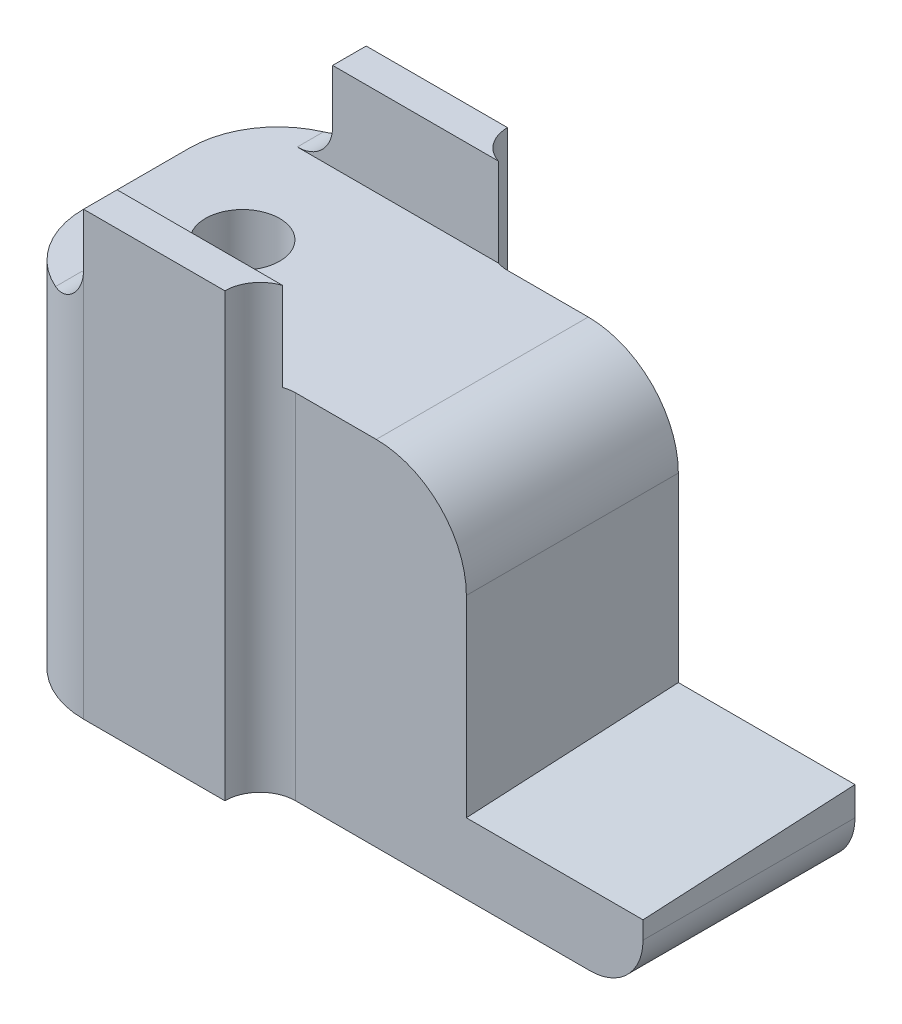
ISO-10303-21;
HEADER;
FILE_DESCRIPTION(('STEP AP214'),'2;1');
FILE_NAME('part.step','',(''),(''),'','','');
FILE_SCHEMA(('AUTOMOTIVE_DESIGN { 1 0 10303 214 1 1 1 1 }'));
ENDSEC;
DATA;
#1=APPLICATION_CONTEXT('core data for automotive mechanical design processes');
#2=APPLICATION_PROTOCOL_DEFINITION('international standard','automotive_design',2000,#1);
#3=PRODUCT_CONTEXT('',#1,'mechanical');
#4=PRODUCT('Part','Part','',(#3));
#5=PRODUCT_RELATED_PRODUCT_CATEGORY('part','',(#4));
#6=PRODUCT_DEFINITION_FORMATION('','',#4);
#7=PRODUCT_DEFINITION_CONTEXT('part definition',#1,'design');
#8=PRODUCT_DEFINITION('design','',#6,#7);
#9=PRODUCT_DEFINITION_SHAPE('','',#8);
#10=(LENGTH_UNIT() NAMED_UNIT(*) SI_UNIT(.MILLI.,.METRE.));
#11=(NAMED_UNIT(*) PLANE_ANGLE_UNIT() SI_UNIT($,.RADIAN.));
#12=(NAMED_UNIT(*) SI_UNIT($,.STERADIAN.) SOLID_ANGLE_UNIT());
#13=UNCERTAINTY_MEASURE_WITH_UNIT(LENGTH_MEASURE(1.E-05),#10,'distance_accuracy_value','');
#14=(GEOMETRIC_REPRESENTATION_CONTEXT(3) GLOBAL_UNCERTAINTY_ASSIGNED_CONTEXT((#13)) GLOBAL_UNIT_ASSIGNED_CONTEXT((#10,
#11,#12)) REPRESENTATION_CONTEXT('',''));
#15=CARTESIAN_POINT('',(0.,0.,0.));
#16=DIRECTION('',(0.,0.,1.));
#17=DIRECTION('',(1.,0.,0.));
#18=AXIS2_PLACEMENT_3D('',#15,#16,#17);
#19=CARTESIAN_POINT('',(18.67,20.,0.));
#20=DIRECTION('',(1.,0.,0.));
#21=DIRECTION('',(0.,0.,-1.));
#22=AXIS2_PLACEMENT_3D('',#19,#20,#21);
#23=PLANE('',#22);
#24=DIRECTION('',(0.,-1.,0.));
#25=VECTOR('',#24,1.);
#26=CARTESIAN_POINT('',(18.67,0.,6.));
#27=LINE('',#26,#25);
#28=CARTESIAN_POINT('',(18.67,14.9,6.));
#29=VERTEX_POINT('',#28);
#30=CARTESIAN_POINT('',(18.67,4.,6.));
#31=VERTEX_POINT('',#30);
#32=EDGE_CURVE('E217',#29,#31,#27,.T.);
#33=ORIENTED_EDGE('',*,*,#32,.T.);
#34=DIRECTION('',(0.,-0.0523359562429443,0.998629534754574));
#35=VECTOR('',#34,1.);
#36=CARTESIAN_POINT('',(18.67,4.,6.));
#37=LINE('',#36,#35);
#38=CARTESIAN_POINT('',(18.67,4.6288933513965,-6.));
#39=VERTEX_POINT('',#38);
#40=EDGE_CURVE('E213',#39,#31,#37,.T.);
#41=ORIENTED_EDGE('',*,*,#40,.F.);
#42=DIRECTION('',(0.,1.,0.));
#43=VECTOR('',#42,1.);
#44=CARTESIAN_POINT('',(18.67,0.,-6.));
#45=LINE('',#44,#43);
#46=CARTESIAN_POINT('',(18.67,14.9,-6.));
#47=VERTEX_POINT('',#46);
#48=EDGE_CURVE('E200',#39,#47,#45,.T.);
#49=ORIENTED_EDGE('',*,*,#48,.T.);
#50=DIRECTION('',(0.,0.,1.));
#51=VECTOR('',#50,1.);
#52=CARTESIAN_POINT('',(18.67,14.9,0.));
#53=LINE('',#52,#51);
#54=EDGE_CURVE('E299',#47,#29,#53,.T.);
#55=ORIENTED_EDGE('',*,*,#54,.T.);
#56=EDGE_LOOP('',(#33,#41,#49,#55));
#57=FACE_BOUND('',#56,.T.);
#58=ADVANCED_FACE('F45',(#57),#23,.T.);
#59=CARTESIAN_POINT('',(0.,20.,0.));
#60=DIRECTION('',(0.,1.,0.));
#61=DIRECTION('',(0.,0.,1.));
#62=AXIS2_PLACEMENT_3D('',#59,#60,#61);
#63=PLANE('',#62);
#64=CARTESIAN_POINT('',(0.,20.,0.));
#65=DIRECTION('',(0.,1.,0.));
#66=DIRECTION('',(0.,0.,1.));
#67=AXIS2_PLACEMENT_3D('',#64,#65,#66);
#68=CIRCLE('',#67,2.1);
#69=CARTESIAN_POINT('',(0.,20.,2.1));
#70=VERTEX_POINT('',#69);
#71=EDGE_CURVE('E258',#70,#70,#68,.T.);
#72=ORIENTED_EDGE('',*,*,#71,.F.);
#73=EDGE_LOOP('',(#72));
#74=FACE_BOUND('',#73,.T.);
#75=DIRECTION('',(1.,0.,0.));
#76=VECTOR('',#75,1.);
#77=CARTESIAN_POINT('',(7.,20.,-6.1));
#78=LINE('',#77,#76);
#79=CARTESIAN_POINT('',(-3.,20.,-6.1));
#80=VERTEX_POINT('',#79);
#81=CARTESIAN_POINT('',(8.37550020015988,20.,-6.1));
#82=VERTEX_POINT('',#81);
#83=EDGE_CURVE('E237',#80,#82,#78,.T.);
#84=ORIENTED_EDGE('',*,*,#83,.F.);
#85=DIRECTION('',(0.,0.,1.));
#86=VECTOR('',#85,1.);
#87=CARTESIAN_POINT('',(-3.,20.,0.));
#88=LINE('',#87,#86);
#89=CARTESIAN_POINT('',(-3.,20.,-7.58257569495584));
#90=VERTEX_POINT('',#89);
#91=EDGE_CURVE('E314',#80,#90,#88,.F.);
#92=ORIENTED_EDGE('',*,*,#91,.T.);
#93=CARTESIAN_POINT('',(-1.,20.,-3.));
#94=DIRECTION('',(0.,1.,0.));
#95=DIRECTION('',(0.,0.,1.));
#96=AXIS2_PLACEMENT_3D('',#93,#94,#95);
#97=CIRCLE('',#96,5.);
#98=CARTESIAN_POINT('',(-6.,20.,-3.));
#99=VERTEX_POINT('',#98);
#100=EDGE_CURVE('E294',#90,#99,#97,.T.);
#101=ORIENTED_EDGE('',*,*,#100,.T.);
#102=DIRECTION('',(0.,0.,1.));
#103=VECTOR('',#102,1.);
#104=CARTESIAN_POINT('',(-6.,20.,0.));
#105=LINE('',#104,#103);
#106=CARTESIAN_POINT('',(-6.,20.,3.));
#107=VERTEX_POINT('',#106);
#108=EDGE_CURVE('E261',#99,#107,#105,.T.);
#109=ORIENTED_EDGE('',*,*,#108,.T.);
#110=CARTESIAN_POINT('',(-1.,20.,3.));
#111=DIRECTION('',(0.,1.,0.));
#112=DIRECTION('',(0.,0.,1.));
#113=AXIS2_PLACEMENT_3D('',#110,#111,#112);
#114=CIRCLE('',#113,5.);
#115=CARTESIAN_POINT('',(-3.,20.,7.58257569495584));
#116=VERTEX_POINT('',#115);
#117=EDGE_CURVE('E291',#107,#116,#114,.T.);
#118=ORIENTED_EDGE('',*,*,#117,.T.);
#119=DIRECTION('',(0.,0.,1.));
#120=VECTOR('',#119,1.);
#121=CARTESIAN_POINT('',(-3.,20.,0.));
#122=LINE('',#121,#120);
#123=CARTESIAN_POINT('',(-3.,20.,6.1));
#124=VERTEX_POINT('',#123);
#125=EDGE_CURVE('E311',#116,#124,#122,.F.);
#126=ORIENTED_EDGE('',*,*,#125,.T.);
#127=DIRECTION('',(-1.,0.,0.));
#128=VECTOR('',#127,1.);
#129=CARTESIAN_POINT('',(7.,20.,6.1));
#130=LINE('',#129,#128);
#131=CARTESIAN_POINT('',(8.3755002001599,20.,6.1));
#132=VERTEX_POINT('',#131);
#133=EDGE_CURVE('E235',#132,#124,#130,.T.);
#134=ORIENTED_EDGE('',*,*,#133,.F.);
#135=CARTESIAN_POINT('',(9.,20.,8.00000000000001));
#136=DIRECTION('',(0.,1.,0.));
#137=DIRECTION('',(0.,0.,1.));
#138=AXIS2_PLACEMENT_3D('',#135,#136,#137);
#139=CIRCLE('',#138,2.);
#140=CARTESIAN_POINT('',(9.,20.,6.));
#141=VERTEX_POINT('',#140);
#142=EDGE_CURVE('E434',#132,#141,#139,.F.);
#143=ORIENTED_EDGE('',*,*,#142,.T.);
#144=DIRECTION('',(-1.,0.,0.));
#145=VECTOR('',#144,1.);
#146=CARTESIAN_POINT('',(66.6638075793812,20.,5.99999999999999));
#147=LINE('',#146,#145);
#148=CARTESIAN_POINT('',(13.57,20.,6.));
#149=VERTEX_POINT('',#148);
#150=EDGE_CURVE('E203',#149,#141,#147,.T.);
#151=ORIENTED_EDGE('',*,*,#150,.F.);
#152=DIRECTION('',(0.,0.,1.));
#153=VECTOR('',#152,1.);
#154=CARTESIAN_POINT('',(13.57,20.,0.));
#155=LINE('',#154,#153);
#156=CARTESIAN_POINT('',(13.57,20.,-6.));
#157=VERTEX_POINT('',#156);
#158=EDGE_CURVE('E304',#149,#157,#155,.F.);
#159=ORIENTED_EDGE('',*,*,#158,.T.);
#160=DIRECTION('',(-1.,0.,0.));
#161=VECTOR('',#160,1.);
#162=CARTESIAN_POINT('',(66.6638075793812,20.,-6.00000000000001));
#163=LINE('',#162,#161);
#164=CARTESIAN_POINT('',(9.,20.,-6.));
#165=VERTEX_POINT('',#164);
#166=EDGE_CURVE('E220',#157,#165,#163,.T.);
#167=ORIENTED_EDGE('',*,*,#166,.T.);
#168=CARTESIAN_POINT('',(9.,20.,-8.));
#169=DIRECTION('',(0.,1.,0.));
#170=DIRECTION('',(0.,0.,1.));
#171=AXIS2_PLACEMENT_3D('',#168,#169,#170);
#172=CIRCLE('',#171,2.);
#173=EDGE_CURVE('E450',#165,#82,#172,.F.);
#174=ORIENTED_EDGE('',*,*,#173,.T.);
#175=EDGE_LOOP('',(#84,#92,#101,#109,#118,#126,#134,#143,#151,#159,#167,#174));
#176=FACE_BOUND('',#175,.T.);
#177=ADVANCED_FACE('F369',(#74,#176),#63,.T.);
#178=CARTESIAN_POINT('',(0.,20.,8.));
#179=DIRECTION('',(0.,0.,-1.));
#180=DIRECTION('',(-1.,0.,0.));
#181=AXIS2_PLACEMENT_3D('',#178,#179,#180);
#182=PLANE('',#181);
#183=DIRECTION('',(0.,-1.,0.));
#184=VECTOR('',#183,1.);
#185=CARTESIAN_POINT('',(7.,20.,8.));
#186=LINE('',#185,#184);
#187=CARTESIAN_POINT('',(7.,25.,8.));
#188=VERTEX_POINT('',#187);
#189=CARTESIAN_POINT('',(7.,0.,8.));
#190=VERTEX_POINT('',#189);
#191=EDGE_CURVE('E277',#188,#190,#186,.T.);
#192=ORIENTED_EDGE('',*,*,#191,.F.);
#193=DIRECTION('',(1.,0.,0.));
#194=VECTOR('',#193,1.);
#195=CARTESIAN_POINT('',(7.,25.,8.));
#196=LINE('',#195,#194);
#197=CARTESIAN_POINT('',(-0.999999999999998,25.,8.));
#198=VERTEX_POINT('',#197);
#199=EDGE_CURVE('E238',#198,#188,#196,.T.);
#200=ORIENTED_EDGE('',*,*,#199,.F.);
#201=DIRECTION('',(0.,-1.,0.));
#202=VECTOR('',#201,1.);
#203=CARTESIAN_POINT('',(-0.999999999999998,25.,8.));
#204=LINE('',#203,#202);
#205=CARTESIAN_POINT('',(-1.,22.,8.));
#206=VERTEX_POINT('',#205);
#207=EDGE_CURVE('E231',#198,#206,#204,.T.);
#208=ORIENTED_EDGE('',*,*,#207,.T.);
#209=DIRECTION('',(0.,-1.,0.));
#210=VECTOR('',#209,1.);
#211=CARTESIAN_POINT('',(-1.,20.,8.));
#212=LINE('',#211,#210);
#213=CARTESIAN_POINT('',(-1.,0.,8.));
#214=VERTEX_POINT('',#213);
#215=EDGE_CURVE('E296',#206,#214,#212,.T.);
#216=ORIENTED_EDGE('',*,*,#215,.T.);
#217=DIRECTION('',(1.,0.,0.));
#218=VECTOR('',#217,1.);
#219=CARTESIAN_POINT('',(0.,0.,8.));
#220=LINE('',#219,#218);
#221=EDGE_CURVE('E268',#214,#190,#220,.T.);
#222=ORIENTED_EDGE('',*,*,#221,.T.);
#223=EDGE_LOOP('',(#192,#200,#208,#216,#222));
#224=FACE_BOUND('',#223,.T.);
#225=ADVANCED_FACE('F377',(#224),#182,.F.);
#226=CARTESIAN_POINT('',(0.,20.,-8.));
#227=DIRECTION('',(0.,0.,-1.));
#228=DIRECTION('',(-1.,0.,0.));
#229=AXIS2_PLACEMENT_3D('',#226,#227,#228);
#230=PLANE('',#229);
#231=DIRECTION('',(1.,0.,0.));
#232=VECTOR('',#231,1.);
#233=CARTESIAN_POINT('',(0.,0.,-8.));
#234=LINE('',#233,#232);
#235=CARTESIAN_POINT('',(-1.,0.,-8.));
#236=VERTEX_POINT('',#235);
#237=CARTESIAN_POINT('',(7.,0.,-8.));
#238=VERTEX_POINT('',#237);
#239=EDGE_CURVE('E271',#236,#238,#234,.T.);
#240=ORIENTED_EDGE('',*,*,#239,.F.);
#241=DIRECTION('',(0.,-1.,0.));
#242=VECTOR('',#241,1.);
#243=CARTESIAN_POINT('',(-1.,20.,-8.));
#244=LINE('',#243,#242);
#245=CARTESIAN_POINT('',(-1.,22.,-8.));
#246=VERTEX_POINT('',#245);
#247=EDGE_CURVE('E289',#236,#246,#244,.F.);
#248=ORIENTED_EDGE('',*,*,#247,.T.);
#249=DIRECTION('',(0.,-1.,0.));
#250=VECTOR('',#249,1.);
#251=CARTESIAN_POINT('',(-1.,25.,-8.));
#252=LINE('',#251,#250);
#253=CARTESIAN_POINT('',(-1.,25.,-8.));
#254=VERTEX_POINT('',#253);
#255=EDGE_CURVE('E254',#254,#246,#252,.T.);
#256=ORIENTED_EDGE('',*,*,#255,.F.);
#257=DIRECTION('',(-1.,0.,0.));
#258=VECTOR('',#257,1.);
#259=CARTESIAN_POINT('',(7.,25.,-8.));
#260=LINE('',#259,#258);
#261=CARTESIAN_POINT('',(7.,25.,-8.));
#262=VERTEX_POINT('',#261);
#263=EDGE_CURVE('E244',#262,#254,#260,.T.);
#264=ORIENTED_EDGE('',*,*,#263,.F.);
#265=DIRECTION('',(0.,-1.,0.));
#266=VECTOR('',#265,1.);
#267=CARTESIAN_POINT('',(7.,20.,-8.));
#268=LINE('',#267,#266);
#269=EDGE_CURVE('E265',#262,#238,#268,.T.);
#270=ORIENTED_EDGE('',*,*,#269,.T.);
#271=EDGE_LOOP('',(#240,#248,#256,#264,#270));
#272=FACE_BOUND('',#271,.T.);
#273=ADVANCED_FACE('F411',(#272),#230,.T.);
#274=CARTESIAN_POINT('',(0.,20.,0.));
#275=DIRECTION('',(0.,-1.,0.));
#276=DIRECTION('',(0.,0.,-1.));
#277=AXIS2_PLACEMENT_3D('',#274,#275,#276);
#278=CYLINDRICAL_SURFACE('',#277,2.1);
#279=ORIENTED_EDGE('',*,*,#71,.T.);
#280=EDGE_LOOP('',(#279));
#281=FACE_BOUND('',#280,.T.);
#282=CARTESIAN_POINT('',(0.,0.,0.));
#283=DIRECTION('',(0.,1.,0.));
#284=DIRECTION('',(0.,0.,1.));
#285=AXIS2_PLACEMENT_3D('',#282,#283,#284);
#286=CIRCLE('',#285,2.1);
#287=CARTESIAN_POINT('',(0.,0.,2.1));
#288=VERTEX_POINT('',#287);
#289=EDGE_CURVE('E257',#288,#288,#286,.T.);
#290=ORIENTED_EDGE('',*,*,#289,.F.);
#291=EDGE_LOOP('',(#290));
#292=FACE_BOUND('',#291,.T.);
#293=ADVANCED_FACE('F349',(#281,#292),#278,.F.);
#294=CARTESIAN_POINT('',(-6.,20.,0.));
#295=DIRECTION('',(1.,0.,0.));
#296=DIRECTION('',(0.,0.,-1.));
#297=AXIS2_PLACEMENT_3D('',#294,#295,#296);
#298=PLANE('',#297);
#299=ORIENTED_EDGE('',*,*,#108,.F.);
#300=DIRECTION('',(0.,-1.,0.));
#301=VECTOR('',#300,1.);
#302=CARTESIAN_POINT('',(-6.,0.,-3.));
#303=LINE('',#302,#301);
#304=CARTESIAN_POINT('',(-6.,0.,-3.));
#305=VERTEX_POINT('',#304);
#306=EDGE_CURVE('E282',#99,#305,#303,.T.);
#307=ORIENTED_EDGE('',*,*,#306,.T.);
#308=DIRECTION('',(0.,0.,1.));
#309=VECTOR('',#308,1.);
#310=CARTESIAN_POINT('',(-6.,0.,0.));
#311=LINE('',#310,#309);
#312=CARTESIAN_POINT('',(-6.,0.,3.));
#313=VERTEX_POINT('',#312);
#314=EDGE_CURVE('E262',#305,#313,#311,.T.);
#315=ORIENTED_EDGE('',*,*,#314,.T.);
#316=DIRECTION('',(0.,-1.,0.));
#317=VECTOR('',#316,1.);
#318=CARTESIAN_POINT('',(-6.,20.,3.));
#319=LINE('',#318,#317);
#320=EDGE_CURVE('E280',#313,#107,#319,.F.);
#321=ORIENTED_EDGE('',*,*,#320,.T.);
#322=EDGE_LOOP('',(#299,#307,#315,#321));
#323=FACE_BOUND('',#322,.T.);
#324=ADVANCED_FACE('F406',(#323),#298,.F.);
#325=CARTESIAN_POINT('',(0.,0.,0.));
#326=DIRECTION('',(0.,1.,0.));
#327=DIRECTION('',(0.,0.,1.));
#328=AXIS2_PLACEMENT_3D('',#325,#326,#327);
#329=PLANE('',#328);
#330=ORIENTED_EDGE('',*,*,#289,.T.);
#331=EDGE_LOOP('',(#330));
#332=FACE_BOUND('',#331,.T.);
#333=DIRECTION('',(-1.,0.,0.));
#334=VECTOR('',#333,1.);
#335=CARTESIAN_POINT('',(66.6638075793812,0.,-6.00000000000001));
#336=LINE('',#335,#334);
#337=CARTESIAN_POINT('',(25.67,0.,-6.));
#338=VERTEX_POINT('',#337);
#339=CARTESIAN_POINT('',(9.,0.,-6.));
#340=VERTEX_POINT('',#339);
#341=EDGE_CURVE('E223',#338,#340,#336,.T.);
#342=ORIENTED_EDGE('',*,*,#341,.F.);
#343=DIRECTION('',(0.,0.,-1.));
#344=VECTOR('',#343,1.);
#345=CARTESIAN_POINT('',(25.67,0.,6.));
#346=LINE('',#345,#344);
#347=CARTESIAN_POINT('',(25.67,0.,5.99999999999999));
#348=VERTEX_POINT('',#347);
#349=EDGE_CURVE('E53',#338,#348,#346,.F.);
#350=ORIENTED_EDGE('',*,*,#349,.T.);
#351=DIRECTION('',(-1.,0.,0.));
#352=VECTOR('',#351,1.);
#353=CARTESIAN_POINT('',(66.6638075793812,0.,5.99999999999999));
#354=LINE('',#353,#352);
#355=CARTESIAN_POINT('',(9.,0.,6.));
#356=VERTEX_POINT('',#355);
#357=EDGE_CURVE('E221',#348,#356,#354,.T.);
#358=ORIENTED_EDGE('',*,*,#357,.T.);
#359=CARTESIAN_POINT('',(9.,0.,8.));
#360=DIRECTION('',(0.,1.,0.));
#361=DIRECTION('',(0.,0.,1.));
#362=AXIS2_PLACEMENT_3D('',#359,#360,#361);
#363=CIRCLE('',#362,2.);
#364=EDGE_CURVE('E432',#356,#190,#363,.T.);
#365=ORIENTED_EDGE('',*,*,#364,.T.);
#366=ORIENTED_EDGE('',*,*,#221,.F.);
#367=CARTESIAN_POINT('',(-1.,0.,3.));
#368=DIRECTION('',(0.,1.,0.));
#369=DIRECTION('',(0.,0.,1.));
#370=AXIS2_PLACEMENT_3D('',#367,#368,#369);
#371=CIRCLE('',#370,5.);
#372=EDGE_CURVE('E285',#214,#313,#371,.F.);
#373=ORIENTED_EDGE('',*,*,#372,.T.);
#374=ORIENTED_EDGE('',*,*,#314,.F.);
#375=CARTESIAN_POINT('',(-1.,0.,-3.));
#376=DIRECTION('',(0.,1.,0.));
#377=DIRECTION('',(0.,0.,1.));
#378=AXIS2_PLACEMENT_3D('',#375,#376,#377);
#379=CIRCLE('',#378,5.);
#380=EDGE_CURVE('E287',#305,#236,#379,.F.);
#381=ORIENTED_EDGE('',*,*,#380,.T.);
#382=ORIENTED_EDGE('',*,*,#239,.T.);
#383=CARTESIAN_POINT('',(9.,0.,-8.));
#384=DIRECTION('',(0.,1.,0.));
#385=DIRECTION('',(0.,0.,1.));
#386=AXIS2_PLACEMENT_3D('',#383,#384,#385);
#387=CIRCLE('',#386,2.);
#388=EDGE_CURVE('E436',#238,#340,#387,.T.);
#389=ORIENTED_EDGE('',*,*,#388,.T.);
#390=EDGE_LOOP('',(#342,#350,#358,#365,#366,#373,#374,#381,#382,#389));
#391=FACE_BOUND('',#390,.T.);
#392=ADVANCED_FACE('F347',(#332,#391),#329,.F.);
#393=CARTESIAN_POINT('',(-1.,20.,-3.));
#394=DIRECTION('',(0.,1.,0.));
#395=DIRECTION('',(0.,0.,1.));
#396=AXIS2_PLACEMENT_3D('',#393,#394,#395);
#397=CYLINDRICAL_SURFACE('',#396,5.);
#398=ORIENTED_EDGE('',*,*,#100,.F.);
#399=CARTESIAN_POINT('',(-3.,20.,-7.58257569495584));
#400=CARTESIAN_POINT('',(-2.94882422969423,19.9999944328901,-7.60491893613169));
#401=CARTESIAN_POINT('',(-2.89725932038594,20.0019645357416,-7.62639486475811));
#402=CARTESIAN_POINT('',(-2.79369744624647,20.0099917987297,-7.66751917245971));
#403=CARTESIAN_POINT('',(-2.74170031103067,20.0160506542607,-7.68716678958158));
#404=CARTESIAN_POINT('',(-2.63763614443466,20.0323956305357,-7.72453258534548));
#405=CARTESIAN_POINT('',(-2.58556909074132,20.04268395511,-7.74224975199872));
#406=CARTESIAN_POINT('',(-2.48184232631921,20.0675501736024,-7.77568002270725));
#407=CARTESIAN_POINT('',(-2.43018255226676,20.0821273866197,-7.79139344430844));
#408=CARTESIAN_POINT('',(-2.27615957807409,20.1324602456837,-7.83557512853718));
#409=CARTESIAN_POINT('',(-2.17496470618029,20.1747848693521,-7.86100962684806));
#410=CARTESIAN_POINT('',(-1.97979313568709,20.2762601637192,-7.90408220940223));
#411=CARTESIAN_POINT('',(-1.88580912608439,20.3353934981539,-7.92172827889794));
#412=CARTESIAN_POINT('',(-1.71183330631352,20.4663730533753,-7.94982429535056));
#413=CARTESIAN_POINT('',(-1.63143641191402,20.5376274109362,-7.96053010212969));
#414=CARTESIAN_POINT('',(-1.4828499126527,20.6924165262334,-7.97719428554441));
#415=CARTESIAN_POINT('',(-1.41466630203297,20.7759572776653,-7.98315033593752));
#416=CARTESIAN_POINT('',(-1.29171941866968,20.9542173617868,-7.99186947445244));
#417=CARTESIAN_POINT('',(-1.23715108357621,21.0490731605746,-7.99458807842981));
#418=CARTESIAN_POINT('',(-1.14419740242342,21.2464148211055,-7.99813794238579));
#419=CARTESIAN_POINT('',(-1.10580879749256,21.3488991414377,-7.99896958257891));
#420=CARTESIAN_POINT('',(-1.05083168209967,21.5425568945564,-7.99980466293805));
#421=CARTESIAN_POINT('',(-1.03179497424371,21.6330388257732,-7.99991600343519));
#422=CARTESIAN_POINT('',(-1.01273310942155,21.7700028148672,-7.99998735068458));
#423=CARTESIAN_POINT('',(-1.007961354112,21.8158640735284,-7.99999518940273));
#424=CARTESIAN_POINT('',(-1.00159438841257,21.9078125147172,-8.00000024496916));
#425=CARTESIAN_POINT('',(-0.999999587452212,21.9538997255972,-7.99999746044851));
#426=CARTESIAN_POINT('',(-1.,22.,-8.));
#427=B_SPLINE_CURVE_WITH_KNOTS('',3,(#399,#400,#401,#402,#403,#404,#405,#406,#407,#408,#409,
#410,#411,#412,#413,#414,#415,#416,#417,#418,#419,#420,#421,#422,#423,#424,#425,#426),
.UNSPECIFIED.,.F.,.F.,(4,2,2,2,2,2,2,2,2,2,2,2,2,4),(0.,0.167492523155857,0.335054539512393,
0.502703977545899,0.670326814028303,1.00624515695024,1.34181828783692,1.66418569312858,
1.98671088440652,2.31361840235485,2.64046004409222,2.91692195256549,3.05515140156106,
3.19339866370467),.UNSPECIFIED.);
#428=EDGE_CURVE('E322',#90,#246,#427,.T.);
#429=ORIENTED_EDGE('',*,*,#428,.T.);
#430=ORIENTED_EDGE('',*,*,#247,.F.);
#431=ORIENTED_EDGE('',*,*,#380,.F.);
#432=ORIENTED_EDGE('',*,*,#306,.F.);
#433=EDGE_LOOP('',(#398,#429,#430,#431,#432));
#434=FACE_BOUND('',#433,.T.);
#435=ADVANCED_FACE('F342',(#434),#397,.T.);
#436=CARTESIAN_POINT('',(-1.,20.,3.));
#437=DIRECTION('',(0.,-1.,0.));
#438=DIRECTION('',(0.,0.,-1.));
#439=AXIS2_PLACEMENT_3D('',#436,#437,#438);
#440=CYLINDRICAL_SURFACE('',#439,5.);
#441=ORIENTED_EDGE('',*,*,#117,.F.);
#442=ORIENTED_EDGE('',*,*,#320,.F.);
#443=ORIENTED_EDGE('',*,*,#372,.F.);
#444=ORIENTED_EDGE('',*,*,#215,.F.);
#445=CARTESIAN_POINT('',(-1.,22.,8.));
#446=CARTESIAN_POINT('',(-1.00000038549265,21.9438197541548,7.99999456414493));
#447=CARTESIAN_POINT('',(-1.00236864900355,21.8876663972967,8.00000061230362));
#448=CARTESIAN_POINT('',(-1.01181673847197,21.7757598748005,7.99998932672866));
#449=CARTESIAN_POINT('',(-1.01889637009736,21.720006692752,7.99997199395938));
#450=CARTESIAN_POINT('',(-1.0471406188201,21.5540110913333,7.99981555111103));
#451=CARTESIAN_POINT('',(-1.07531073970212,21.4448774971545,7.99957223424861));
#452=CARTESIAN_POINT('',(-1.14955124400367,21.2328770712525,7.99789929959921));
#453=CARTESIAN_POINT('',(-1.19563178406896,21.1300138336818,7.99646900817901));
#454=CARTESIAN_POINT('',(-1.30435718615597,20.9335144275432,7.99102372189666));
#455=CARTESIAN_POINT('',(-1.36699938502222,20.839876778798,7.9870091424456));
#456=CARTESIAN_POINT('',(-1.50647304039909,20.6651631277837,7.97477013350808));
#457=CARTESIAN_POINT('',(-1.58320785105937,20.5840080953729,7.9665737399993));
#458=CARTESIAN_POINT('',(-1.74860056990878,20.43593255847,7.94434379333329));
#459=CARTESIAN_POINT('',(-1.83725310106598,20.3690056694805,7.93031286665657));
#460=CARTESIAN_POINT('',(-2.0208507527559,20.252786313052,7.89554368797716));
#461=CARTESIAN_POINT('',(-2.11556316287538,20.2030688102354,7.87499553674227));
#462=CARTESIAN_POINT('',(-2.31007399857495,20.1197880524475,7.82635923189559));
#463=CARTESIAN_POINT('',(-2.40987477844154,20.0862323516169,7.7982675619256));
#464=CARTESIAN_POINT('',(-2.59213696859381,20.0402167218544,7.74051188293385));
#465=CARTESIAN_POINT('',(-2.67432048017418,20.0249724563857,7.71214255413355));
#466=CARTESIAN_POINT('',(-2.79709127754244,20.0098925660219,7.66608785901439));
#467=CARTESIAN_POINT('',(-2.83790170771628,20.0061635773717,7.65016551568938));
#468=CARTESIAN_POINT('',(-2.91921721963934,20.0012171338854,7.6171996635397));
#469=CARTESIAN_POINT('',(-2.95972232929329,19.9999994466869,7.60015625859374));
#470=CARTESIAN_POINT('',(-3.,20.,7.58257569495584));
#471=B_SPLINE_CURVE_WITH_KNOTS('',3,(#445,#446,#447,#448,#449,#450,#451,#452,#453,#454,#455,
#456,#457,#458,#459,#460,#461,#462,#463,#464,#465,#466,#467,#468,#469,#470),.UNSPECIFIED.,.F.,
.F.,(4,2,2,2,2,2,2,2,2,2,2,2,4),(0.,0.168437420635297,0.33686789407931,0.673269387204793,
1.00986192597299,1.346400372718,1.68071165855397,2.01487261305517,2.34006609941677,
2.66541143636622,2.9294255911562,3.06124371233518,3.19304963627351),.UNSPECIFIED.);
#472=EDGE_CURVE('E331',#206,#116,#471,.T.);
#473=ORIENTED_EDGE('',*,*,#472,.T.);
#474=EDGE_LOOP('',(#441,#442,#443,#444,#473));
#475=FACE_BOUND('',#474,.T.);
#476=ADVANCED_FACE('F346',(#475),#440,.T.);
#477=CARTESIAN_POINT('',(-1.,25.,-8.));
#478=DIRECTION('',(1.,0.,0.));
#479=DIRECTION('',(0.,0.,-1.));
#480=AXIS2_PLACEMENT_3D('',#477,#478,#479);
#481=PLANE('',#480);
#482=ORIENTED_EDGE('',*,*,#255,.T.);
#483=DIRECTION('',(0.,0.,1.));
#484=VECTOR('',#483,1.);
#485=CARTESIAN_POINT('',(-1.,22.,-8.));
#486=LINE('',#485,#484);
#487=CARTESIAN_POINT('',(-1.,22.,-6.1));
#488=VERTEX_POINT('',#487);
#489=EDGE_CURVE('E308',#246,#488,#486,.T.);
#490=ORIENTED_EDGE('',*,*,#489,.T.);
#491=DIRECTION('',(0.,-1.,0.));
#492=VECTOR('',#491,1.);
#493=CARTESIAN_POINT('',(-1.,25.,-6.1));
#494=LINE('',#493,#492);
#495=CARTESIAN_POINT('',(-1.,25.,-6.1));
#496=VERTEX_POINT('',#495);
#497=EDGE_CURVE('E250',#496,#488,#494,.T.);
#498=ORIENTED_EDGE('',*,*,#497,.F.);
#499=DIRECTION('',(0.,0.,1.));
#500=VECTOR('',#499,1.);
#501=CARTESIAN_POINT('',(-1.,25.,-8.));
#502=LINE('',#501,#500);
#503=EDGE_CURVE('E246',#254,#496,#502,.T.);
#504=ORIENTED_EDGE('',*,*,#503,.F.);
#505=EDGE_LOOP('',(#482,#490,#498,#504));
#506=FACE_BOUND('',#505,.T.);
#507=ADVANCED_FACE('F353',(#506),#481,.F.);
#508=CARTESIAN_POINT('',(7.,25.,-6.1));
#509=DIRECTION('',(0.,0.,-1.));
#510=DIRECTION('',(-1.,0.,0.));
#511=AXIS2_PLACEMENT_3D('',#508,#509,#510);
#512=PLANE('',#511);
#513=ORIENTED_EDGE('',*,*,#83,.T.);
#514=DIRECTION('',(0.,1.,0.));
#515=VECTOR('',#514,1.);
#516=CARTESIAN_POINT('',(8.37550020015988,20.,-6.1));
#517=LINE('',#516,#515);
#518=CARTESIAN_POINT('',(8.37550020015988,25.,-6.1));
#519=VERTEX_POINT('',#518);
#520=EDGE_CURVE('E454',#82,#519,#517,.T.);
#521=ORIENTED_EDGE('',*,*,#520,.T.);
#522=DIRECTION('',(1.,0.,0.));
#523=VECTOR('',#522,1.);
#524=CARTESIAN_POINT('',(7.,25.,-6.1));
#525=LINE('',#524,#523);
#526=EDGE_CURVE('E248',#496,#519,#525,.T.);
#527=ORIENTED_EDGE('',*,*,#526,.F.);
#528=ORIENTED_EDGE('',*,*,#497,.T.);
#529=CARTESIAN_POINT('',(-3.,22.,-6.1));
#530=DIRECTION('',(0.,0.,-1.));
#531=DIRECTION('',(-1.,0.,0.));
#532=AXIS2_PLACEMENT_3D('',#529,#530,#531);
#533=CIRCLE('',#532,2.);
#534=EDGE_CURVE('E319',#488,#80,#533,.T.);
#535=ORIENTED_EDGE('',*,*,#534,.T.);
#536=EDGE_LOOP('',(#513,#521,#527,#528,#535));
#537=FACE_BOUND('',#536,.T.);
#538=ADVANCED_FACE('F396',(#537),#512,.F.);
#539=CARTESIAN_POINT('',(0.,25.,0.));
#540=DIRECTION('',(0.,-1.,0.));
#541=DIRECTION('',(0.,0.,-1.));
#542=AXIS2_PLACEMENT_3D('',#539,#540,#541);
#543=PLANE('',#542);
#544=ORIENTED_EDGE('',*,*,#526,.T.);
#545=CARTESIAN_POINT('',(9.,25.,-8.));
#546=DIRECTION('',(0.,-1.,0.));
#547=DIRECTION('',(0.,0.,-1.));
#548=AXIS2_PLACEMENT_3D('',#545,#546,#547);
#549=CIRCLE('',#548,2.);
#550=EDGE_CURVE('E462',#519,#262,#549,.T.);
#551=ORIENTED_EDGE('',*,*,#550,.T.);
#552=ORIENTED_EDGE('',*,*,#263,.T.);
#553=ORIENTED_EDGE('',*,*,#503,.T.);
#554=EDGE_LOOP('',(#544,#551,#552,#553));
#555=FACE_BOUND('',#554,.T.);
#556=ADVANCED_FACE('F386',(#555),#543,.F.);
#557=CARTESIAN_POINT('',(7.,25.,6.1));
#558=DIRECTION('',(0.,0.,1.));
#559=DIRECTION('',(1.,0.,0.));
#560=AXIS2_PLACEMENT_3D('',#557,#558,#559);
#561=PLANE('',#560);
#562=ORIENTED_EDGE('',*,*,#133,.T.);
#563=CARTESIAN_POINT('',(-3.,22.,6.1));
#564=DIRECTION('',(0.,0.,1.));
#565=DIRECTION('',(1.,0.,0.));
#566=AXIS2_PLACEMENT_3D('',#563,#564,#565);
#567=CIRCLE('',#566,2.);
#568=CARTESIAN_POINT('',(-0.999999999999999,22.,6.1));
#569=VERTEX_POINT('',#568);
#570=EDGE_CURVE('E457',#124,#569,#567,.T.);
#571=ORIENTED_EDGE('',*,*,#570,.T.);
#572=DIRECTION('',(0.,-1.,0.));
#573=VECTOR('',#572,1.);
#574=CARTESIAN_POINT('',(-0.999999999999999,25.,6.1));
#575=LINE('',#574,#573);
#576=CARTESIAN_POINT('',(-0.999999999999999,25.,6.1));
#577=VERTEX_POINT('',#576);
#578=EDGE_CURVE('E216',#577,#569,#575,.T.);
#579=ORIENTED_EDGE('',*,*,#578,.F.);
#580=DIRECTION('',(-1.,0.,0.));
#581=VECTOR('',#580,1.);
#582=CARTESIAN_POINT('',(7.,25.,6.1));
#583=LINE('',#582,#581);
#584=CARTESIAN_POINT('',(8.37550020015991,25.,6.1));
#585=VERTEX_POINT('',#584);
#586=EDGE_CURVE('E240',#585,#577,#583,.T.);
#587=ORIENTED_EDGE('',*,*,#586,.F.);
#588=DIRECTION('',(0.,-1.,0.));
#589=VECTOR('',#588,1.);
#590=CARTESIAN_POINT('',(8.37550020015991,25.,6.1));
#591=LINE('',#590,#589);
#592=EDGE_CURVE('E431',#585,#132,#591,.T.);
#593=ORIENTED_EDGE('',*,*,#592,.T.);
#594=EDGE_LOOP('',(#562,#571,#579,#587,#593));
#595=FACE_BOUND('',#594,.T.);
#596=ADVANCED_FACE('F382',(#595),#561,.F.);
#597=CARTESIAN_POINT('',(-0.999999999999998,25.,8.));
#598=DIRECTION('',(1.,0.,0.));
#599=DIRECTION('',(0.,0.,-1.));
#600=AXIS2_PLACEMENT_3D('',#597,#598,#599);
#601=PLANE('',#600);
#602=ORIENTED_EDGE('',*,*,#578,.T.);
#603=DIRECTION('',(0.,0.,1.));
#604=VECTOR('',#603,1.);
#605=CARTESIAN_POINT('',(-0.999999999999998,22.,8.));
#606=LINE('',#605,#604);
#607=EDGE_CURVE('E316',#569,#206,#606,.T.);
#608=ORIENTED_EDGE('',*,*,#607,.T.);
#609=ORIENTED_EDGE('',*,*,#207,.F.);
#610=DIRECTION('',(0.,0.,1.));
#611=VECTOR('',#610,1.);
#612=CARTESIAN_POINT('',(-0.999999999999998,25.,8.));
#613=LINE('',#612,#611);
#614=EDGE_CURVE('E234',#577,#198,#613,.T.);
#615=ORIENTED_EDGE('',*,*,#614,.F.);
#616=EDGE_LOOP('',(#602,#608,#609,#615));
#617=FACE_BOUND('',#616,.T.);
#618=ADVANCED_FACE('F385',(#617),#601,.F.);
#619=CARTESIAN_POINT('',(0.,25.,0.));
#620=DIRECTION('',(0.,-1.,0.));
#621=DIRECTION('',(0.,0.,-1.));
#622=AXIS2_PLACEMENT_3D('',#619,#620,#621);
#623=PLANE('',#622);
#624=ORIENTED_EDGE('',*,*,#199,.T.);
#625=CARTESIAN_POINT('',(9.,25.,8.00000000000001));
#626=DIRECTION('',(0.,-1.,0.));
#627=DIRECTION('',(0.,0.,-1.));
#628=AXIS2_PLACEMENT_3D('',#625,#626,#627);
#629=CIRCLE('',#628,2.);
#630=EDGE_CURVE('E424',#188,#585,#629,.T.);
#631=ORIENTED_EDGE('',*,*,#630,.T.);
#632=ORIENTED_EDGE('',*,*,#586,.T.);
#633=ORIENTED_EDGE('',*,*,#614,.T.);
#634=EDGE_LOOP('',(#624,#631,#632,#633));
#635=FACE_BOUND('',#634,.T.);
#636=ADVANCED_FACE('F390',(#635),#623,.F.);
#637=CARTESIAN_POINT('',(66.6638075793812,0.,5.99999999999999));
#638=DIRECTION('',(0.,0.,-1.));
#639=DIRECTION('',(0.,1.,0.));
#640=AXIS2_PLACEMENT_3D('',#637,#638,#639);
#641=PLANE('',#640);
#642=ORIENTED_EDGE('',*,*,#357,.F.);
#643=CARTESIAN_POINT('',(25.67,3.,5.99999999999999));
#644=DIRECTION('',(0.,0.,-1.));
#645=DIRECTION('',(0.,1.,0.));
#646=AXIS2_PLACEMENT_3D('',#643,#644,#645);
#647=CIRCLE('',#646,3.);
#648=CARTESIAN_POINT('',(28.67,3.,6.));
#649=VERTEX_POINT('',#648);
#650=EDGE_CURVE('E12',#348,#649,#647,.F.);
#651=ORIENTED_EDGE('',*,*,#650,.T.);
#652=DIRECTION('',(0.,-1.,0.));
#653=VECTOR('',#652,1.);
#654=CARTESIAN_POINT('',(28.67,4.,6.));
#655=LINE('',#654,#653);
#656=CARTESIAN_POINT('',(28.67,4.,6.));
#657=VERTEX_POINT('',#656);
#658=EDGE_CURVE('E194',#657,#649,#655,.T.);
#659=ORIENTED_EDGE('',*,*,#658,.F.);
#660=DIRECTION('',(-1.,0.,0.));
#661=VECTOR('',#660,1.);
#662=CARTESIAN_POINT('',(28.67,4.,6.));
#663=LINE('',#662,#661);
#664=EDGE_CURVE('E204',#657,#31,#663,.T.);
#665=ORIENTED_EDGE('',*,*,#664,.T.);
#666=ORIENTED_EDGE('',*,*,#32,.F.);
#667=CARTESIAN_POINT('',(13.57,14.9,6.));
#668=DIRECTION('',(0.,0.,-1.));
#669=DIRECTION('',(0.,1.,0.));
#670=AXIS2_PLACEMENT_3D('',#667,#668,#669);
#671=CIRCLE('',#670,5.1);
#672=EDGE_CURVE('E302',#29,#149,#671,.F.);
#673=ORIENTED_EDGE('',*,*,#672,.T.);
#674=ORIENTED_EDGE('',*,*,#150,.T.);
#675=DIRECTION('',(0.,-1.,0.));
#676=VECTOR('',#675,1.);
#677=CARTESIAN_POINT('',(9.,0.,6.));
#678=LINE('',#677,#676);
#679=EDGE_CURVE('E448',#141,#356,#678,.T.);
#680=ORIENTED_EDGE('',*,*,#679,.T.);
#681=EDGE_LOOP('',(#642,#651,#659,#665,#666,#673,#674,#680));
#682=FACE_BOUND('',#681,.T.);
#683=ADVANCED_FACE('F365',(#682),#641,.F.);
#684=CARTESIAN_POINT('',(66.6638075793812,0.,-6.00000000000001));
#685=DIRECTION('',(0.,0.,1.));
#686=DIRECTION('',(1.,0.,0.));
#687=AXIS2_PLACEMENT_3D('',#684,#685,#686);
#688=PLANE('',#687);
#689=DIRECTION('',(0.,1.,0.));
#690=VECTOR('',#689,1.);
#691=CARTESIAN_POINT('',(28.67,0.,-6.));
#692=LINE('',#691,#690);
#693=CARTESIAN_POINT('',(28.67,3.,-6.));
#694=VERTEX_POINT('',#693);
#695=CARTESIAN_POINT('',(28.67,4.6288933513965,-5.99999999999999));
#696=VERTEX_POINT('',#695);
#697=EDGE_CURVE('E185',#694,#696,#692,.T.);
#698=ORIENTED_EDGE('',*,*,#697,.F.);
#699=CARTESIAN_POINT('',(25.67,3.,-6.));
#700=DIRECTION('',(0.,0.,1.));
#701=DIRECTION('',(1.,0.,0.));
#702=AXIS2_PLACEMENT_3D('',#699,#700,#701);
#703=CIRCLE('',#702,3.);
#704=EDGE_CURVE('E67',#694,#338,#703,.F.);
#705=ORIENTED_EDGE('',*,*,#704,.T.);
#706=ORIENTED_EDGE('',*,*,#341,.T.);
#707=DIRECTION('',(0.,1.,0.));
#708=VECTOR('',#707,1.);
#709=CARTESIAN_POINT('',(9.,0.,-6.));
#710=LINE('',#709,#708);
#711=EDGE_CURVE('E451',#340,#165,#710,.T.);
#712=ORIENTED_EDGE('',*,*,#711,.T.);
#713=ORIENTED_EDGE('',*,*,#166,.F.);
#714=CARTESIAN_POINT('',(13.57,14.9,-6.));
#715=DIRECTION('',(0.,0.,1.));
#716=DIRECTION('',(1.,0.,0.));
#717=AXIS2_PLACEMENT_3D('',#714,#715,#716);
#718=CIRCLE('',#717,5.1);
#719=EDGE_CURVE('E306',#157,#47,#718,.F.);
#720=ORIENTED_EDGE('',*,*,#719,.T.);
#721=ORIENTED_EDGE('',*,*,#48,.F.);
#722=DIRECTION('',(-1.,0.,0.));
#723=VECTOR('',#722,1.);
#724=CARTESIAN_POINT('',(28.67,4.6288933513965,-5.99999999999999));
#725=LINE('',#724,#723);
#726=EDGE_CURVE('E197',#696,#39,#725,.T.);
#727=ORIENTED_EDGE('',*,*,#726,.F.);
#728=EDGE_LOOP('',(#698,#705,#706,#712,#713,#720,#721,#727));
#729=FACE_BOUND('',#728,.T.);
#730=ADVANCED_FACE('F198',(#729),#688,.F.);
#731=CARTESIAN_POINT('',(13.57,14.9,0.));
#732=DIRECTION('',(0.,0.,1.));
#733=DIRECTION('',(1.,0.,0.));
#734=AXIS2_PLACEMENT_3D('',#731,#732,#733);
#735=CYLINDRICAL_SURFACE('',#734,5.1);
#736=ORIENTED_EDGE('',*,*,#719,.F.);
#737=ORIENTED_EDGE('',*,*,#158,.F.);
#738=ORIENTED_EDGE('',*,*,#672,.F.);
#739=ORIENTED_EDGE('',*,*,#54,.F.);
#740=EDGE_LOOP('',(#736,#737,#738,#739));
#741=FACE_BOUND('',#740,.T.);
#742=ADVANCED_FACE('F355',(#741),#735,.T.);
#743=CARTESIAN_POINT('',(-3.,22.,-8.));
#744=DIRECTION('',(0.,0.,1.));
#745=DIRECTION('',(1.,0.,0.));
#746=AXIS2_PLACEMENT_3D('',#743,#744,#745);
#747=CYLINDRICAL_SURFACE('',#746,2.);
#748=ORIENTED_EDGE('',*,*,#428,.F.);
#749=ORIENTED_EDGE('',*,*,#91,.F.);
#750=ORIENTED_EDGE('',*,*,#534,.F.);
#751=ORIENTED_EDGE('',*,*,#489,.F.);
#752=EDGE_LOOP('',(#748,#749,#750,#751));
#753=FACE_BOUND('',#752,.T.);
#754=ADVANCED_FACE('F339',(#753),#747,.F.);
#755=CARTESIAN_POINT('',(-3.,22.,8.));
#756=DIRECTION('',(0.,0.,1.));
#757=DIRECTION('',(1.,0.,0.));
#758=AXIS2_PLACEMENT_3D('',#755,#756,#757);
#759=CYLINDRICAL_SURFACE('',#758,2.);
#760=ORIENTED_EDGE('',*,*,#570,.F.);
#761=ORIENTED_EDGE('',*,*,#125,.F.);
#762=ORIENTED_EDGE('',*,*,#472,.F.);
#763=ORIENTED_EDGE('',*,*,#607,.F.);
#764=EDGE_LOOP('',(#760,#761,#762,#763));
#765=FACE_BOUND('',#764,.T.);
#766=ADVANCED_FACE('F362',(#765),#759,.F.);
#767=CARTESIAN_POINT('',(9.,0.,-8.));
#768=DIRECTION('',(0.,1.,0.));
#769=DIRECTION('',(0.,0.,1.));
#770=AXIS2_PLACEMENT_3D('',#767,#768,#769);
#771=CYLINDRICAL_SURFACE('',#770,2.);
#772=ORIENTED_EDGE('',*,*,#388,.F.);
#773=ORIENTED_EDGE('',*,*,#269,.F.);
#774=ORIENTED_EDGE('',*,*,#550,.F.);
#775=ORIENTED_EDGE('',*,*,#520,.F.);
#776=ORIENTED_EDGE('',*,*,#173,.F.);
#777=ORIENTED_EDGE('',*,*,#711,.F.);
#778=EDGE_LOOP('',(#772,#773,#774,#775,#776,#777));
#779=FACE_BOUND('',#778,.T.);
#780=ADVANCED_FACE('F469',(#779),#771,.F.);
#781=CARTESIAN_POINT('',(9.,0.,8.));
#782=DIRECTION('',(0.,-1.,0.));
#783=DIRECTION('',(0.,0.,-1.));
#784=AXIS2_PLACEMENT_3D('',#781,#782,#783);
#785=CYLINDRICAL_SURFACE('',#784,2.);
#786=ORIENTED_EDGE('',*,*,#630,.F.);
#787=ORIENTED_EDGE('',*,*,#191,.T.);
#788=ORIENTED_EDGE('',*,*,#364,.F.);
#789=ORIENTED_EDGE('',*,*,#679,.F.);
#790=ORIENTED_EDGE('',*,*,#142,.F.);
#791=ORIENTED_EDGE('',*,*,#592,.F.);
#792=EDGE_LOOP('',(#786,#787,#788,#789,#790,#791));
#793=FACE_BOUND('',#792,.T.);
#794=ADVANCED_FACE('F428',(#793),#785,.F.);
#795=CARTESIAN_POINT('',(28.67,4.,6.));
#796=DIRECTION('',(0.,-0.998629534754574,-0.0523359562429443));
#797=DIRECTION('',(0.,0.0523359562429443,-0.998629534754574));
#798=AXIS2_PLACEMENT_3D('',#795,#796,#797);
#799=PLANE('',#798);
#800=ORIENTED_EDGE('',*,*,#40,.T.);
#801=ORIENTED_EDGE('',*,*,#664,.F.);
#802=DIRECTION('',(0.,-0.0523359562429443,0.998629534754574));
#803=VECTOR('',#802,1.);
#804=CARTESIAN_POINT('',(28.67,4.,6.));
#805=LINE('',#804,#803);
#806=EDGE_CURVE('E190',#696,#657,#805,.T.);
#807=ORIENTED_EDGE('',*,*,#806,.F.);
#808=ORIENTED_EDGE('',*,*,#726,.T.);
#809=EDGE_LOOP('',(#800,#801,#807,#808));
#810=FACE_BOUND('',#809,.T.);
#811=ADVANCED_FACE('F206',(#810),#799,.F.);
#812=CARTESIAN_POINT('',(28.67,0.,0.));
#813=DIRECTION('',(1.,0.,0.));
#814=DIRECTION('',(0.,0.,-1.));
#815=AXIS2_PLACEMENT_3D('',#812,#813,#814);
#816=PLANE('',#815);
#817=ORIENTED_EDGE('',*,*,#658,.T.);
#818=DIRECTION('',(0.,0.,-1.));
#819=VECTOR('',#818,1.);
#820=CARTESIAN_POINT('',(28.67,3.,-6.));
#821=LINE('',#820,#819);
#822=EDGE_CURVE('E193',#649,#694,#821,.T.);
#823=ORIENTED_EDGE('',*,*,#822,.T.);
#824=ORIENTED_EDGE('',*,*,#697,.T.);
#825=ORIENTED_EDGE('',*,*,#806,.T.);
#826=EDGE_LOOP('',(#817,#823,#824,#825));
#827=FACE_BOUND('',#826,.T.);
#828=ADVANCED_FACE('F188',(#827),#816,.T.);
#829=CARTESIAN_POINT('',(25.67,3.,0.));
#830=DIRECTION('',(0.,0.,1.));
#831=DIRECTION('',(1.,0.,0.));
#832=AXIS2_PLACEMENT_3D('',#829,#830,#831);
#833=CYLINDRICAL_SURFACE('',#832,3.);
#834=ORIENTED_EDGE('',*,*,#650,.F.);
#835=ORIENTED_EDGE('',*,*,#349,.F.);
#836=ORIENTED_EDGE('',*,*,#704,.F.);
#837=ORIENTED_EDGE('',*,*,#822,.F.);
#838=EDGE_LOOP('',(#834,#835,#836,#837));
#839=FACE_BOUND('',#838,.T.);
#840=ADVANCED_FACE('F47',(#839),#833,.T.);
#841=CLOSED_SHELL('',(#58,#177,#225,#273,#293,#324,#392,#435,#476,#507,#538,#556,#596,#618,#636,
#683,#730,#742,#754,#766,#780,#794,#811,#828,#840));
#842=MANIFOLD_SOLID_BREP('B2',#841);
#843=ADVANCED_BREP_SHAPE_REPRESENTATION('',(#18,#842),#14);
#844=SHAPE_DEFINITION_REPRESENTATION(#9,#843);
ENDSEC;
END-ISO-10303-21;
